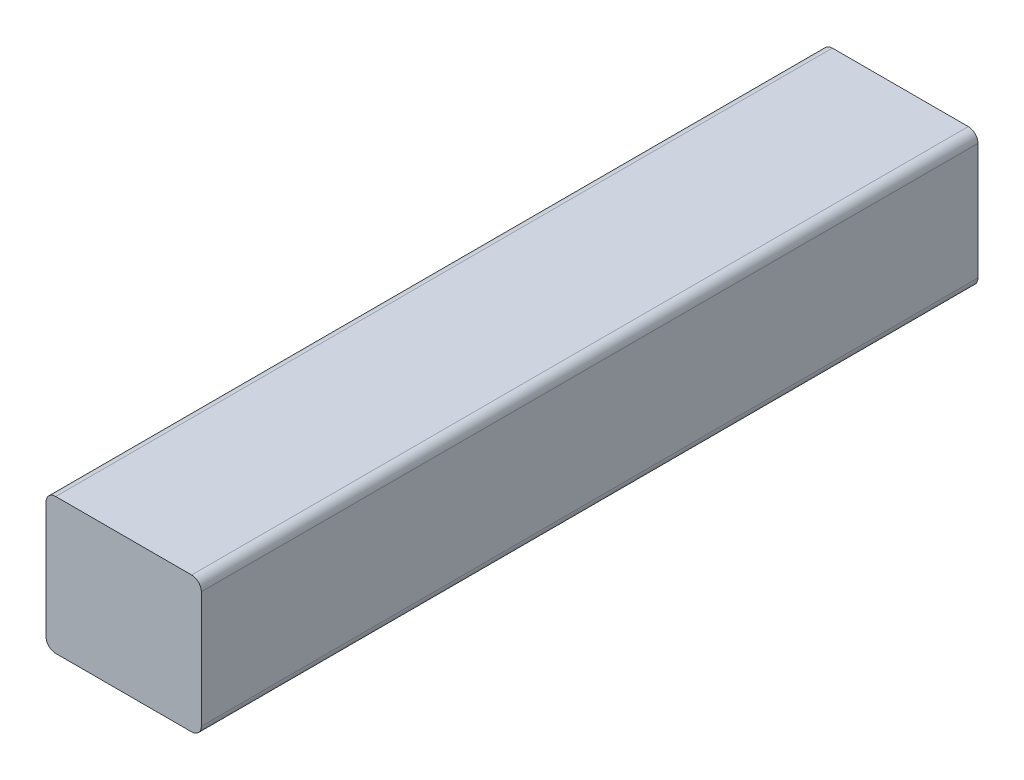
ISO-10303-21;
HEADER;
FILE_DESCRIPTION(('STEP AP214'),'2;1');
FILE_NAME('part.step','',(''),(''),'','','');
FILE_SCHEMA(('AUTOMOTIVE_DESIGN { 1 0 10303 214 1 1 1 1 }'));
ENDSEC;
DATA;
#1=APPLICATION_CONTEXT('core data for automotive mechanical design processes');
#2=APPLICATION_PROTOCOL_DEFINITION('international standard','automotive_design',2000,#1);
#3=PRODUCT_CONTEXT('',#1,'mechanical');
#4=PRODUCT('Part','Part','',(#3));
#5=PRODUCT_RELATED_PRODUCT_CATEGORY('part','',(#4));
#6=PRODUCT_DEFINITION_FORMATION('','',#4);
#7=PRODUCT_DEFINITION_CONTEXT('part definition',#1,'design');
#8=PRODUCT_DEFINITION('design','',#6,#7);
#9=PRODUCT_DEFINITION_SHAPE('','',#8);
#10=(LENGTH_UNIT() NAMED_UNIT(*) SI_UNIT(.MILLI.,.METRE.));
#11=(NAMED_UNIT(*) PLANE_ANGLE_UNIT() SI_UNIT($,.RADIAN.));
#12=(NAMED_UNIT(*) SI_UNIT($,.STERADIAN.) SOLID_ANGLE_UNIT());
#13=UNCERTAINTY_MEASURE_WITH_UNIT(LENGTH_MEASURE(1.E-05),#10,'distance_accuracy_value','');
#14=(GEOMETRIC_REPRESENTATION_CONTEXT(3) GLOBAL_UNCERTAINTY_ASSIGNED_CONTEXT((#13)) GLOBAL_UNIT_ASSIGNED_CONTEXT((#10,
#11,#12)) REPRESENTATION_CONTEXT('',''));
#15=CARTESIAN_POINT('',(0.,0.,0.));
#16=DIRECTION('',(0.,0.,1.));
#17=DIRECTION('',(1.,0.,0.));
#18=AXIS2_PLACEMENT_3D('',#15,#16,#17);
#19=CARTESIAN_POINT('',(4.,3.5,40.));
#20=DIRECTION('',(-1.,0.,0.));
#21=DIRECTION('',(0.,-1.,0.));
#22=AXIS2_PLACEMENT_3D('',#19,#20,#21);
#23=PLANE('',#22);
#24=DIRECTION('',(0.,1.,0.));
#25=VECTOR('',#24,1.);
#26=CARTESIAN_POINT('',(4.,3.5,0.));
#27=LINE('',#26,#25);
#28=CARTESIAN_POINT('',(4.,-3.,0.));
#29=VERTEX_POINT('',#28);
#30=CARTESIAN_POINT('',(4.,3.,0.));
#31=VERTEX_POINT('',#30);
#32=EDGE_CURVE('E132',#29,#31,#27,.T.);
#33=ORIENTED_EDGE('',*,*,#32,.T.);
#34=DIRECTION('',(0.,0.,-1.));
#35=VECTOR('',#34,1.);
#36=CARTESIAN_POINT('',(4.,3.,40.));
#37=LINE('',#36,#35);
#38=CARTESIAN_POINT('',(4.,3.,40.));
#39=VERTEX_POINT('',#38);
#40=EDGE_CURVE('E110',#31,#39,#37,.F.);
#41=ORIENTED_EDGE('',*,*,#40,.T.);
#42=DIRECTION('',(0.,1.,0.));
#43=VECTOR('',#42,1.);
#44=CARTESIAN_POINT('',(4.,3.5,40.));
#45=LINE('',#44,#43);
#46=CARTESIAN_POINT('',(4.,-3.,40.));
#47=VERTEX_POINT('',#46);
#48=EDGE_CURVE('E141',#47,#39,#45,.T.);
#49=ORIENTED_EDGE('',*,*,#48,.F.);
#50=DIRECTION('',(0.,0.,-1.));
#51=VECTOR('',#50,1.);
#52=CARTESIAN_POINT('',(4.,-3.,40.));
#53=LINE('',#52,#51);
#54=EDGE_CURVE('E115',#47,#29,#53,.T.);
#55=ORIENTED_EDGE('',*,*,#54,.T.);
#56=EDGE_LOOP('',(#33,#41,#49,#55));
#57=FACE_BOUND('',#56,.T.);
#58=ADVANCED_FACE('F39',(#57),#23,.F.);
#59=CARTESIAN_POINT('',(-4.,3.5,40.));
#60=DIRECTION('',(0.,-1.,0.));
#61=DIRECTION('',(0.,0.,-1.));
#62=AXIS2_PLACEMENT_3D('',#59,#60,#61);
#63=PLANE('',#62);
#64=DIRECTION('',(-1.,0.,0.));
#65=VECTOR('',#64,1.);
#66=CARTESIAN_POINT('',(-4.,3.5,40.));
#67=LINE('',#66,#65);
#68=CARTESIAN_POINT('',(3.5,3.5,40.));
#69=VERTEX_POINT('',#68);
#70=CARTESIAN_POINT('',(-3.5,3.5,40.));
#71=VERTEX_POINT('',#70);
#72=EDGE_CURVE('E125',#69,#71,#67,.T.);
#73=ORIENTED_EDGE('',*,*,#72,.F.);
#74=DIRECTION('',(0.,0.,-1.));
#75=VECTOR('',#74,1.);
#76=CARTESIAN_POINT('',(3.5,3.5,40.));
#77=LINE('',#76,#75);
#78=CARTESIAN_POINT('',(3.5,3.5,0.));
#79=VERTEX_POINT('',#78);
#80=EDGE_CURVE('E109',#69,#79,#77,.T.);
#81=ORIENTED_EDGE('',*,*,#80,.T.);
#82=DIRECTION('',(-1.,0.,0.));
#83=VECTOR('',#82,1.);
#84=CARTESIAN_POINT('',(-4.,3.5,0.));
#85=LINE('',#84,#83);
#86=CARTESIAN_POINT('',(-3.5,3.5,0.));
#87=VERTEX_POINT('',#86);
#88=EDGE_CURVE('E122',#79,#87,#85,.T.);
#89=ORIENTED_EDGE('',*,*,#88,.T.);
#90=DIRECTION('',(0.,0.,-1.));
#91=VECTOR('',#90,1.);
#92=CARTESIAN_POINT('',(-3.5,3.5,40.));
#93=LINE('',#92,#91);
#94=EDGE_CURVE('E127',#87,#71,#93,.F.);
#95=ORIENTED_EDGE('',*,*,#94,.T.);
#96=EDGE_LOOP('',(#73,#81,#89,#95));
#97=FACE_BOUND('',#96,.T.);
#98=ADVANCED_FACE('F121',(#97),#63,.F.);
#99=CARTESIAN_POINT('',(-4.,3.5,40.));
#100=DIRECTION('',(1.,0.,0.));
#101=DIRECTION('',(0.,1.,0.));
#102=AXIS2_PLACEMENT_3D('',#99,#100,#101);
#103=PLANE('',#102);
#104=DIRECTION('',(0.,-1.,0.));
#105=VECTOR('',#104,1.);
#106=CARTESIAN_POINT('',(-4.,3.5,40.));
#107=LINE('',#106,#105);
#108=CARTESIAN_POINT('',(-4.,3.,40.));
#109=VERTEX_POINT('',#108);
#110=CARTESIAN_POINT('',(-4.,-3.,40.));
#111=VERTEX_POINT('',#110);
#112=EDGE_CURVE('E167',#109,#111,#107,.T.);
#113=ORIENTED_EDGE('',*,*,#112,.F.);
#114=DIRECTION('',(0.,0.,-1.));
#115=VECTOR('',#114,1.);
#116=CARTESIAN_POINT('',(-4.,3.,40.));
#117=LINE('',#116,#115);
#118=CARTESIAN_POINT('',(-4.,3.,0.));
#119=VERTEX_POINT('',#118);
#120=EDGE_CURVE('E160',#109,#119,#117,.T.);
#121=ORIENTED_EDGE('',*,*,#120,.T.);
#122=DIRECTION('',(0.,-1.,0.));
#123=VECTOR('',#122,1.);
#124=CARTESIAN_POINT('',(-4.,3.5,0.));
#125=LINE('',#124,#123);
#126=CARTESIAN_POINT('',(-4.,-3.,0.));
#127=VERTEX_POINT('',#126);
#128=EDGE_CURVE('E131',#119,#127,#125,.T.);
#129=ORIENTED_EDGE('',*,*,#128,.T.);
#130=DIRECTION('',(0.,0.,-1.));
#131=VECTOR('',#130,1.);
#132=CARTESIAN_POINT('',(-4.,-3.,40.));
#133=LINE('',#132,#131);
#134=EDGE_CURVE('E158',#127,#111,#133,.F.);
#135=ORIENTED_EDGE('',*,*,#134,.T.);
#136=EDGE_LOOP('',(#113,#121,#129,#135));
#137=FACE_BOUND('',#136,.T.);
#138=ADVANCED_FACE('F165',(#137),#103,.F.);
#139=CARTESIAN_POINT('',(-4.,-3.5,40.));
#140=DIRECTION('',(0.,1.,0.));
#141=DIRECTION('',(0.,0.,1.));
#142=AXIS2_PLACEMENT_3D('',#139,#140,#141);
#143=PLANE('',#142);
#144=DIRECTION('',(1.,0.,0.));
#145=VECTOR('',#144,1.);
#146=CARTESIAN_POINT('',(-4.,-3.5,40.));
#147=LINE('',#146,#145);
#148=CARTESIAN_POINT('',(-3.5,-3.5,40.));
#149=VERTEX_POINT('',#148);
#150=CARTESIAN_POINT('',(3.5,-3.5,40.));
#151=VERTEX_POINT('',#150);
#152=EDGE_CURVE('E142',#149,#151,#147,.T.);
#153=ORIENTED_EDGE('',*,*,#152,.F.);
#154=DIRECTION('',(0.,0.,-1.));
#155=VECTOR('',#154,1.);
#156=CARTESIAN_POINT('',(-3.5,-3.5,40.));
#157=LINE('',#156,#155);
#158=CARTESIAN_POINT('',(-3.5,-3.5,0.));
#159=VERTEX_POINT('',#158);
#160=EDGE_CURVE('E11',#149,#159,#157,.T.);
#161=ORIENTED_EDGE('',*,*,#160,.T.);
#162=DIRECTION('',(1.,0.,0.));
#163=VECTOR('',#162,1.);
#164=CARTESIAN_POINT('',(-4.,-3.5,0.));
#165=LINE('',#164,#163);
#166=CARTESIAN_POINT('',(3.5,-3.5,0.));
#167=VERTEX_POINT('',#166);
#168=EDGE_CURVE('E135',#159,#167,#165,.T.);
#169=ORIENTED_EDGE('',*,*,#168,.T.);
#170=DIRECTION('',(0.,0.,-1.));
#171=VECTOR('',#170,1.);
#172=CARTESIAN_POINT('',(3.5,-3.5,40.));
#173=LINE('',#172,#171);
#174=EDGE_CURVE('E47',#167,#151,#173,.F.);
#175=ORIENTED_EDGE('',*,*,#174,.T.);
#176=EDGE_LOOP('',(#153,#161,#169,#175));
#177=FACE_BOUND('',#176,.T.);
#178=ADVANCED_FACE('F174',(#177),#143,.F.);
#179=CARTESIAN_POINT('',(0.,0.,40.));
#180=DIRECTION('',(0.,0.,1.));
#181=DIRECTION('',(1.,0.,0.));
#182=AXIS2_PLACEMENT_3D('',#179,#180,#181);
#183=PLANE('',#182);
#184=ORIENTED_EDGE('',*,*,#48,.T.);
#185=CARTESIAN_POINT('',(3.5,3.,40.));
#186=DIRECTION('',(0.,0.,1.));
#187=DIRECTION('',(1.,0.,0.));
#188=AXIS2_PLACEMENT_3D('',#185,#186,#187);
#189=CIRCLE('',#188,0.5);
#190=EDGE_CURVE('E156',#39,#69,#189,.T.);
#191=ORIENTED_EDGE('',*,*,#190,.T.);
#192=ORIENTED_EDGE('',*,*,#72,.T.);
#193=CARTESIAN_POINT('',(-3.5,3.,40.));
#194=DIRECTION('',(0.,0.,1.));
#195=DIRECTION('',(1.,0.,0.));
#196=AXIS2_PLACEMENT_3D('',#193,#194,#195);
#197=CIRCLE('',#196,0.5);
#198=EDGE_CURVE('E154',#71,#109,#197,.T.);
#199=ORIENTED_EDGE('',*,*,#198,.T.);
#200=ORIENTED_EDGE('',*,*,#112,.T.);
#201=CARTESIAN_POINT('',(-3.5,-3.,40.));
#202=DIRECTION('',(0.,0.,1.));
#203=DIRECTION('',(1.,0.,0.));
#204=AXIS2_PLACEMENT_3D('',#201,#202,#203);
#205=CIRCLE('',#204,0.5);
#206=EDGE_CURVE('E60',#111,#149,#205,.T.);
#207=ORIENTED_EDGE('',*,*,#206,.T.);
#208=ORIENTED_EDGE('',*,*,#152,.T.);
#209=CARTESIAN_POINT('',(3.5,-3.,40.));
#210=DIRECTION('',(0.,0.,1.));
#211=DIRECTION('',(1.,0.,0.));
#212=AXIS2_PLACEMENT_3D('',#209,#210,#211);
#213=CIRCLE('',#212,0.5);
#214=EDGE_CURVE('E151',#151,#47,#213,.T.);
#215=ORIENTED_EDGE('',*,*,#214,.T.);
#216=EDGE_LOOP('',(#184,#191,#192,#199,#200,#207,#208,#215));
#217=FACE_BOUND('',#216,.T.);
#218=ADVANCED_FACE('F181',(#217),#183,.T.);
#219=CARTESIAN_POINT('',(0.,0.,0.));
#220=DIRECTION('',(0.,0.,1.));
#221=DIRECTION('',(1.,0.,0.));
#222=AXIS2_PLACEMENT_3D('',#219,#220,#221);
#223=PLANE('',#222);
#224=ORIENTED_EDGE('',*,*,#88,.F.);
#225=CARTESIAN_POINT('',(3.5,3.,0.));
#226=DIRECTION('',(0.,0.,1.));
#227=DIRECTION('',(1.,0.,0.));
#228=AXIS2_PLACEMENT_3D('',#225,#226,#227);
#229=CIRCLE('',#228,0.5);
#230=EDGE_CURVE('E105',#79,#31,#229,.F.);
#231=ORIENTED_EDGE('',*,*,#230,.T.);
#232=ORIENTED_EDGE('',*,*,#32,.F.);
#233=CARTESIAN_POINT('',(3.5,-3.,0.));
#234=DIRECTION('',(0.,0.,1.));
#235=DIRECTION('',(1.,0.,0.));
#236=AXIS2_PLACEMENT_3D('',#233,#234,#235);
#237=CIRCLE('',#236,0.5);
#238=EDGE_CURVE('E126',#29,#167,#237,.F.);
#239=ORIENTED_EDGE('',*,*,#238,.T.);
#240=ORIENTED_EDGE('',*,*,#168,.F.);
#241=CARTESIAN_POINT('',(-3.5,-3.,0.));
#242=DIRECTION('',(0.,0.,1.));
#243=DIRECTION('',(1.,0.,0.));
#244=AXIS2_PLACEMENT_3D('',#241,#242,#243);
#245=CIRCLE('',#244,0.5);
#246=EDGE_CURVE('E145',#159,#127,#245,.F.);
#247=ORIENTED_EDGE('',*,*,#246,.T.);
#248=ORIENTED_EDGE('',*,*,#128,.F.);
#249=CARTESIAN_POINT('',(-3.5,3.,0.));
#250=DIRECTION('',(0.,0.,1.));
#251=DIRECTION('',(1.,0.,0.));
#252=AXIS2_PLACEMENT_3D('',#249,#250,#251);
#253=CIRCLE('',#252,0.5);
#254=EDGE_CURVE('E116',#119,#87,#253,.F.);
#255=ORIENTED_EDGE('',*,*,#254,.T.);
#256=EDGE_LOOP('',(#224,#231,#232,#239,#240,#247,#248,#255));
#257=FACE_BOUND('',#256,.T.);
#258=ADVANCED_FACE('F129',(#257),#223,.F.);
#259=CARTESIAN_POINT('',(3.5,3.,40.));
#260=DIRECTION('',(0.,0.,-1.));
#261=DIRECTION('',(-1.,0.,0.));
#262=AXIS2_PLACEMENT_3D('',#259,#260,#261);
#263=CYLINDRICAL_SURFACE('',#262,0.5);
#264=ORIENTED_EDGE('',*,*,#190,.F.);
#265=ORIENTED_EDGE('',*,*,#40,.F.);
#266=ORIENTED_EDGE('',*,*,#230,.F.);
#267=ORIENTED_EDGE('',*,*,#80,.F.);
#268=EDGE_LOOP('',(#264,#265,#266,#267));
#269=FACE_BOUND('',#268,.T.);
#270=ADVANCED_FACE('F108',(#269),#263,.T.);
#271=CARTESIAN_POINT('',(-3.5,3.,40.));
#272=DIRECTION('',(0.,0.,-1.));
#273=DIRECTION('',(-1.,0.,0.));
#274=AXIS2_PLACEMENT_3D('',#271,#272,#273);
#275=CYLINDRICAL_SURFACE('',#274,0.5);
#276=ORIENTED_EDGE('',*,*,#198,.F.);
#277=ORIENTED_EDGE('',*,*,#94,.F.);
#278=ORIENTED_EDGE('',*,*,#254,.F.);
#279=ORIENTED_EDGE('',*,*,#120,.F.);
#280=EDGE_LOOP('',(#276,#277,#278,#279));
#281=FACE_BOUND('',#280,.T.);
#282=ADVANCED_FACE('F189',(#281),#275,.T.);
#283=CARTESIAN_POINT('',(-3.5,-3.,40.));
#284=DIRECTION('',(0.,0.,-1.));
#285=DIRECTION('',(-1.,0.,0.));
#286=AXIS2_PLACEMENT_3D('',#283,#284,#285);
#287=CYLINDRICAL_SURFACE('',#286,0.5);
#288=ORIENTED_EDGE('',*,*,#206,.F.);
#289=ORIENTED_EDGE('',*,*,#134,.F.);
#290=ORIENTED_EDGE('',*,*,#246,.F.);
#291=ORIENTED_EDGE('',*,*,#160,.F.);
#292=EDGE_LOOP('',(#288,#289,#290,#291));
#293=FACE_BOUND('',#292,.T.);
#294=ADVANCED_FACE('F173',(#293),#287,.T.);
#295=CARTESIAN_POINT('',(3.5,-3.,40.));
#296=DIRECTION('',(0.,0.,-1.));
#297=DIRECTION('',(-1.,0.,0.));
#298=AXIS2_PLACEMENT_3D('',#295,#296,#297);
#299=CYLINDRICAL_SURFACE('',#298,0.5);
#300=ORIENTED_EDGE('',*,*,#214,.F.);
#301=ORIENTED_EDGE('',*,*,#174,.F.);
#302=ORIENTED_EDGE('',*,*,#238,.F.);
#303=ORIENTED_EDGE('',*,*,#54,.F.);
#304=EDGE_LOOP('',(#300,#301,#302,#303));
#305=FACE_BOUND('',#304,.T.);
#306=ADVANCED_FACE('F41',(#305),#299,.T.);
#307=CLOSED_SHELL('',(#58,#98,#138,#178,#218,#258,#270,#282,#294,#306));
#308=MANIFOLD_SOLID_BREP('B2',#307);
#309=ADVANCED_BREP_SHAPE_REPRESENTATION('',(#18,#308),#14);
#310=SHAPE_DEFINITION_REPRESENTATION(#9,#309);
ENDSEC;
END-ISO-10303-21;
